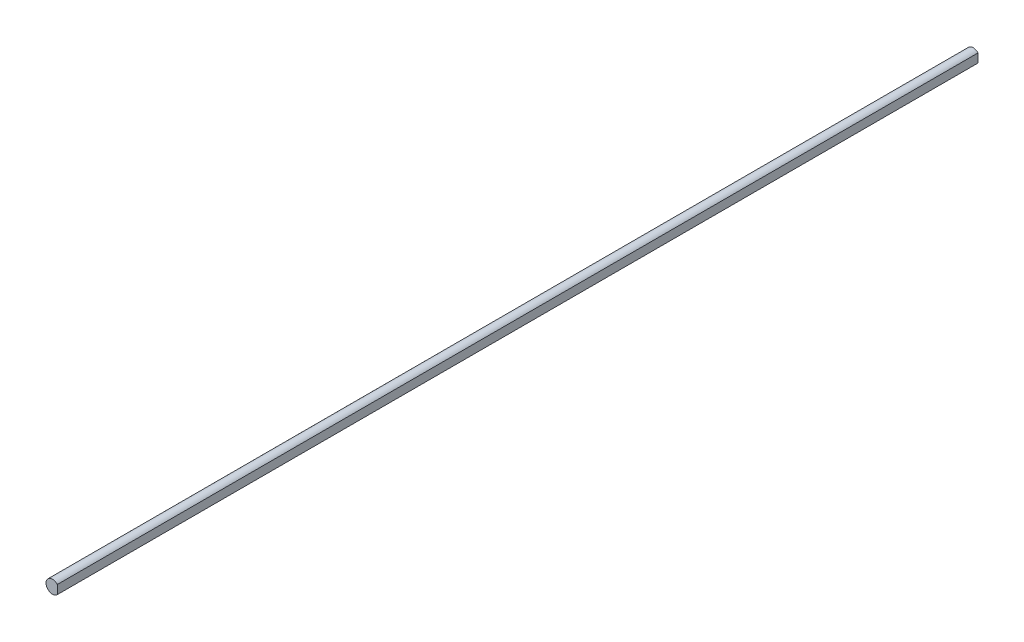
ISO-10303-21;
HEADER;
FILE_DESCRIPTION(('STEP AP214'),'2;1');
FILE_NAME('part.step','',(''),(''),'','','');
FILE_SCHEMA(('AUTOMOTIVE_DESIGN { 1 0 10303 214 1 1 1 1 }'));
ENDSEC;
DATA;
#1=APPLICATION_CONTEXT('core data for automotive mechanical design processes');
#2=APPLICATION_PROTOCOL_DEFINITION('international standard','automotive_design',2000,#1);
#3=PRODUCT_CONTEXT('',#1,'mechanical');
#4=PRODUCT('Part','Part','',(#3));
#5=PRODUCT_RELATED_PRODUCT_CATEGORY('part','',(#4));
#6=PRODUCT_DEFINITION_FORMATION('','',#4);
#7=PRODUCT_DEFINITION_CONTEXT('part definition',#1,'design');
#8=PRODUCT_DEFINITION('design','',#6,#7);
#9=PRODUCT_DEFINITION_SHAPE('','',#8);
#10=(LENGTH_UNIT() NAMED_UNIT(*) SI_UNIT(.MILLI.,.METRE.));
#11=(NAMED_UNIT(*) PLANE_ANGLE_UNIT() SI_UNIT($,.RADIAN.));
#12=(NAMED_UNIT(*) SI_UNIT($,.STERADIAN.) SOLID_ANGLE_UNIT());
#13=UNCERTAINTY_MEASURE_WITH_UNIT(LENGTH_MEASURE(1.E-05),#10,'distance_accuracy_value','');
#14=(GEOMETRIC_REPRESENTATION_CONTEXT(3) GLOBAL_UNCERTAINTY_ASSIGNED_CONTEXT((#13)) GLOBAL_UNIT_ASSIGNED_CONTEXT((#10,
#11,#12)) REPRESENTATION_CONTEXT('',''));
#15=CARTESIAN_POINT('',(0.,0.,0.));
#16=DIRECTION('',(0.,0.,1.));
#17=DIRECTION('',(1.,0.,0.));
#18=AXIS2_PLACEMENT_3D('',#15,#16,#17);
#19=CARTESIAN_POINT('',(0.,0.,103.1875));
#20=DIRECTION('',(0.,0.,1.));
#21=DIRECTION('',(1.,0.,0.));
#22=AXIS2_PLACEMENT_3D('',#19,#20,#21);
#23=PLANE('',#22);
#24=DIRECTION('',(0.,1.,0.));
#25=VECTOR('',#24,1.);
#26=CARTESIAN_POINT('',(1.0795,-0.983737769936684,103.1875));
#27=LINE('',#26,#25);
#28=CARTESIAN_POINT('',(1.0795,0.983737769936684,103.1875));
#29=VERTEX_POINT('',#28);
#30=CARTESIAN_POINT('',(1.0795,-0.983737769936684,103.1875));
#31=VERTEX_POINT('',#30);
#32=EDGE_CURVE('E39',#29,#31,#27,.F.);
#33=ORIENTED_EDGE('',*,*,#32,.F.);
#34=CARTESIAN_POINT('',(0.,0.,103.1875));
#35=DIRECTION('',(0.,0.,1.));
#36=DIRECTION('',(1.,0.,0.));
#37=AXIS2_PLACEMENT_3D('',#34,#35,#36);
#38=CIRCLE('',#37,1.4605);
#39=EDGE_CURVE('E19',#31,#29,#38,.F.);
#40=ORIENTED_EDGE('',*,*,#39,.F.);
#41=EDGE_LOOP('',(#33,#40));
#42=FACE_BOUND('',#41,.T.);
#43=ADVANCED_FACE('F16',(#42),#23,.T.);
#44=CARTESIAN_POINT('',(1.0795,-0.983737769936684,-103.1875));
#45=DIRECTION('',(1.,0.,0.));
#46=DIRECTION('',(0.,0.,-1.));
#47=AXIS2_PLACEMENT_3D('',#44,#45,#46);
#48=PLANE('',#47);
#49=DIRECTION('',(0.,0.,1.));
#50=VECTOR('',#49,1.);
#51=CARTESIAN_POINT('',(1.0795,-0.983737769936684,-103.1875));
#52=LINE('',#51,#50);
#53=CARTESIAN_POINT('',(1.0795,-0.983737769936684,-103.1875));
#54=VERTEX_POINT('',#53);
#55=EDGE_CURVE('E43',#54,#31,#52,.T.);
#56=ORIENTED_EDGE('',*,*,#55,.F.);
#57=DIRECTION('',(0.,1.,0.));
#58=VECTOR('',#57,1.);
#59=CARTESIAN_POINT('',(1.0795,0.,-103.1875));
#60=LINE('',#59,#58);
#61=CARTESIAN_POINT('',(1.0795,0.983737769936684,-103.1875));
#62=VERTEX_POINT('',#61);
#63=EDGE_CURVE('E32',#54,#62,#60,.T.);
#64=ORIENTED_EDGE('',*,*,#63,.T.);
#65=DIRECTION('',(0.,0.,1.));
#66=VECTOR('',#65,1.);
#67=CARTESIAN_POINT('',(1.0795,0.983737769936684,-103.1875));
#68=LINE('',#67,#66);
#69=EDGE_CURVE('E25',#29,#62,#68,.F.);
#70=ORIENTED_EDGE('',*,*,#69,.F.);
#71=ORIENTED_EDGE('',*,*,#32,.T.);
#72=EDGE_LOOP('',(#56,#64,#70,#71));
#73=FACE_BOUND('',#72,.T.);
#74=ADVANCED_FACE('F41',(#73),#48,.T.);
#75=CARTESIAN_POINT('',(0.,0.,-103.1875));
#76=DIRECTION('',(0.,0.,1.));
#77=DIRECTION('',(1.,0.,0.));
#78=AXIS2_PLACEMENT_3D('',#75,#76,#77);
#79=PLANE('',#78);
#80=CARTESIAN_POINT('',(0.,0.,-103.1875));
#81=DIRECTION('',(0.,0.,1.));
#82=DIRECTION('',(1.,0.,0.));
#83=AXIS2_PLACEMENT_3D('',#80,#81,#82);
#84=CIRCLE('',#83,1.4605);
#85=EDGE_CURVE('E10',#62,#54,#84,.T.);
#86=ORIENTED_EDGE('',*,*,#85,.F.);
#87=ORIENTED_EDGE('',*,*,#63,.F.);
#88=EDGE_LOOP('',(#86,#87));
#89=FACE_BOUND('',#88,.T.);
#90=ADVANCED_FACE('F54',(#89),#79,.F.);
#91=CARTESIAN_POINT('',(0.,0.,-103.1875));
#92=DIRECTION('',(0.,0.,1.));
#93=DIRECTION('',(1.,0.,0.));
#94=AXIS2_PLACEMENT_3D('',#91,#92,#93);
#95=CYLINDRICAL_SURFACE('',#94,1.4605);
#96=ORIENTED_EDGE('',*,*,#69,.T.);
#97=ORIENTED_EDGE('',*,*,#85,.T.);
#98=ORIENTED_EDGE('',*,*,#55,.T.);
#99=ORIENTED_EDGE('',*,*,#39,.T.);
#100=EDGE_LOOP('',(#96,#97,#98,#99));
#101=FACE_BOUND('',#100,.T.);
#102=ADVANCED_FACE('F49',(#101),#95,.T.);
#103=CLOSED_SHELL('',(#43,#74,#90,#102));
#104=MANIFOLD_SOLID_BREP('B1',#103);
#105=ADVANCED_BREP_SHAPE_REPRESENTATION('',(#18,#104),#14);
#106=SHAPE_DEFINITION_REPRESENTATION(#9,#105);
ENDSEC;
END-ISO-10303-21;
